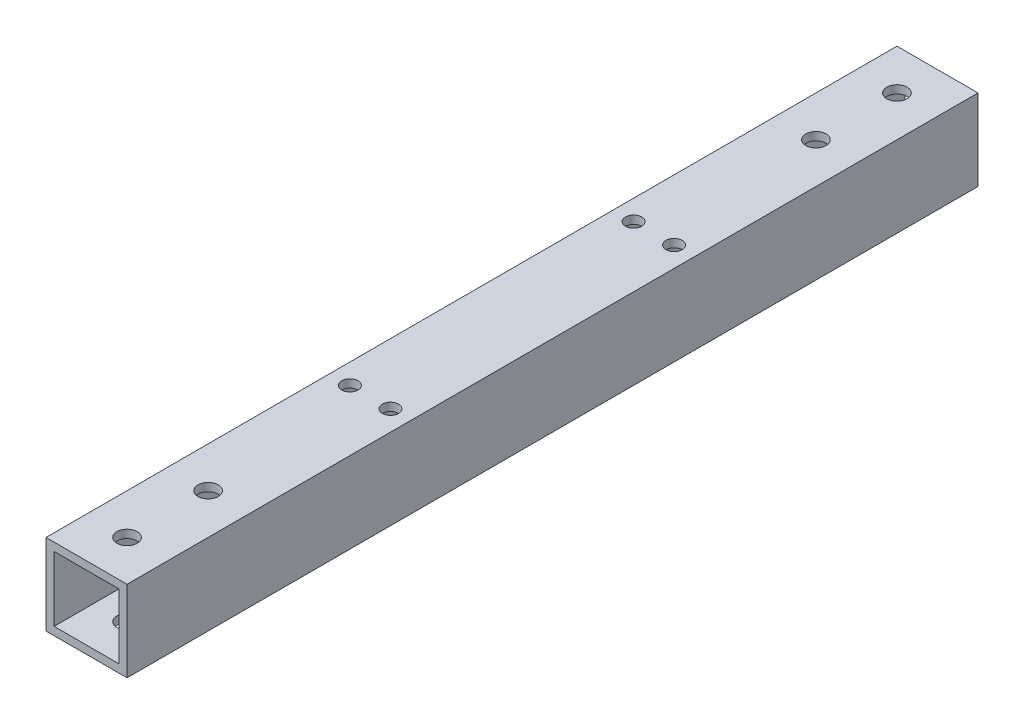
ISO-10303-21;
HEADER;
FILE_DESCRIPTION(('STEP AP214'),'2;1');
FILE_NAME('part.step','',(''),(''),'','','');
FILE_SCHEMA(('AUTOMOTIVE_DESIGN { 1 0 10303 214 1 1 1 1 }'));
ENDSEC;
DATA;
#1=APPLICATION_CONTEXT('core data for automotive mechanical design processes');
#2=APPLICATION_PROTOCOL_DEFINITION('international standard','automotive_design',2000,#1);
#3=PRODUCT_CONTEXT('',#1,'mechanical');
#4=PRODUCT('Part','Part','',(#3));
#5=PRODUCT_RELATED_PRODUCT_CATEGORY('part','',(#4));
#6=PRODUCT_DEFINITION_FORMATION('','',#4);
#7=PRODUCT_DEFINITION_CONTEXT('part definition',#1,'design');
#8=PRODUCT_DEFINITION('design','',#6,#7);
#9=PRODUCT_DEFINITION_SHAPE('','',#8);
#10=(LENGTH_UNIT() NAMED_UNIT(*) SI_UNIT(.MILLI.,.METRE.));
#11=(NAMED_UNIT(*) PLANE_ANGLE_UNIT() SI_UNIT($,.RADIAN.));
#12=(NAMED_UNIT(*) SI_UNIT($,.STERADIAN.) SOLID_ANGLE_UNIT());
#13=UNCERTAINTY_MEASURE_WITH_UNIT(LENGTH_MEASURE(1.E-05),#10,'distance_accuracy_value','');
#14=(GEOMETRIC_REPRESENTATION_CONTEXT(3) GLOBAL_UNCERTAINTY_ASSIGNED_CONTEXT((#13)) GLOBAL_UNIT_ASSIGNED_CONTEXT((#10,
#11,#12)) REPRESENTATION_CONTEXT('',''));
#15=CARTESIAN_POINT('',(0.,0.,0.));
#16=DIRECTION('',(0.,0.,1.));
#17=DIRECTION('',(1.,0.,0.));
#18=AXIS2_PLACEMENT_3D('',#15,#16,#17);
#19=CARTESIAN_POINT('',(0.,0.,210.));
#20=DIRECTION('',(0.,0.,1.));
#21=DIRECTION('',(1.,0.,0.));
#22=AXIS2_PLACEMENT_3D('',#19,#20,#21);
#23=PLANE('',#22);
#24=DIRECTION('',(0.,1.,0.));
#25=VECTOR('',#24,1.);
#26=CARTESIAN_POINT('',(10.,10.,210.));
#27=LINE('',#26,#25);
#28=CARTESIAN_POINT('',(10.,-10.,210.));
#29=VERTEX_POINT('',#28);
#30=CARTESIAN_POINT('',(10.,10.,210.));
#31=VERTEX_POINT('',#30);
#32=EDGE_CURVE('E143',#29,#31,#27,.T.);
#33=ORIENTED_EDGE('',*,*,#32,.T.);
#34=DIRECTION('',(-1.,0.,0.));
#35=VECTOR('',#34,1.);
#36=CARTESIAN_POINT('',(-9.99999999999999,10.,210.));
#37=LINE('',#36,#35);
#38=CARTESIAN_POINT('',(-9.99999999999999,10.,210.));
#39=VERTEX_POINT('',#38);
#40=EDGE_CURVE('E146',#31,#39,#37,.T.);
#41=ORIENTED_EDGE('',*,*,#40,.T.);
#42=DIRECTION('',(0.,-1.,0.));
#43=VECTOR('',#42,1.);
#44=CARTESIAN_POINT('',(-9.99999999999999,10.,210.));
#45=LINE('',#44,#43);
#46=CARTESIAN_POINT('',(-9.99999999999999,-10.,210.));
#47=VERTEX_POINT('',#46);
#48=EDGE_CURVE('E149',#39,#47,#45,.T.);
#49=ORIENTED_EDGE('',*,*,#48,.T.);
#50=DIRECTION('',(1.,0.,0.));
#51=VECTOR('',#50,1.);
#52=CARTESIAN_POINT('',(-9.99999999999999,-10.,210.));
#53=LINE('',#52,#51);
#54=EDGE_CURVE('E151',#47,#29,#53,.T.);
#55=ORIENTED_EDGE('',*,*,#54,.T.);
#56=EDGE_LOOP('',(#33,#41,#49,#55));
#57=FACE_BOUND('',#56,.T.);
#58=DIRECTION('',(-1.,0.,0.));
#59=VECTOR('',#58,1.);
#60=CARTESIAN_POINT('',(-8.,8.,210.));
#61=LINE('',#60,#59);
#62=CARTESIAN_POINT('',(8.,8.,210.));
#63=VERTEX_POINT('',#62);
#64=CARTESIAN_POINT('',(-8.,8.,210.));
#65=VERTEX_POINT('',#64);
#66=EDGE_CURVE('E113',#63,#65,#61,.T.);
#67=ORIENTED_EDGE('',*,*,#66,.F.);
#68=DIRECTION('',(0.,1.,0.));
#69=VECTOR('',#68,1.);
#70=CARTESIAN_POINT('',(8.,8.,210.));
#71=LINE('',#70,#69);
#72=CARTESIAN_POINT('',(8.,-8.,210.));
#73=VERTEX_POINT('',#72);
#74=EDGE_CURVE('E105',#73,#63,#71,.T.);
#75=ORIENTED_EDGE('',*,*,#74,.F.);
#76=DIRECTION('',(1.,0.,0.));
#77=VECTOR('',#76,1.);
#78=CARTESIAN_POINT('',(-8.,-8.,210.));
#79=LINE('',#78,#77);
#80=CARTESIAN_POINT('',(-8.,-8.,210.));
#81=VERTEX_POINT('',#80);
#82=EDGE_CURVE('E127',#81,#73,#79,.T.);
#83=ORIENTED_EDGE('',*,*,#82,.F.);
#84=DIRECTION('',(0.,-1.,0.));
#85=VECTOR('',#84,1.);
#86=CARTESIAN_POINT('',(-8.,8.,210.));
#87=LINE('',#86,#85);
#88=EDGE_CURVE('E125',#65,#81,#87,.T.);
#89=ORIENTED_EDGE('',*,*,#88,.F.);
#90=EDGE_LOOP('',(#67,#75,#83,#89));
#91=FACE_BOUND('',#90,.T.);
#92=ADVANCED_FACE('F38',(#57,#91),#23,.T.);
#93=CARTESIAN_POINT('',(0.,0.,0.));
#94=DIRECTION('',(0.,0.,1.));
#95=DIRECTION('',(1.,0.,0.));
#96=AXIS2_PLACEMENT_3D('',#93,#94,#95);
#97=PLANE('',#96);
#98=DIRECTION('',(0.,1.,0.));
#99=VECTOR('',#98,1.);
#100=CARTESIAN_POINT('',(10.,10.,0.));
#101=LINE('',#100,#99);
#102=CARTESIAN_POINT('',(10.,-10.,0.));
#103=VERTEX_POINT('',#102);
#104=CARTESIAN_POINT('',(10.,10.,0.));
#105=VERTEX_POINT('',#104);
#106=EDGE_CURVE('E121',#103,#105,#101,.T.);
#107=ORIENTED_EDGE('',*,*,#106,.F.);
#108=DIRECTION('',(1.,0.,0.));
#109=VECTOR('',#108,1.);
#110=CARTESIAN_POINT('',(-9.99999999999999,-10.,0.));
#111=LINE('',#110,#109);
#112=CARTESIAN_POINT('',(-9.99999999999999,-10.,0.));
#113=VERTEX_POINT('',#112);
#114=EDGE_CURVE('E147',#113,#103,#111,.T.);
#115=ORIENTED_EDGE('',*,*,#114,.F.);
#116=DIRECTION('',(0.,-1.,0.));
#117=VECTOR('',#116,1.);
#118=CARTESIAN_POINT('',(-9.99999999999999,10.,0.));
#119=LINE('',#118,#117);
#120=CARTESIAN_POINT('',(-9.99999999999999,10.,0.));
#121=VERTEX_POINT('',#120);
#122=EDGE_CURVE('E158',#121,#113,#119,.T.);
#123=ORIENTED_EDGE('',*,*,#122,.F.);
#124=DIRECTION('',(-1.,0.,0.));
#125=VECTOR('',#124,1.);
#126=CARTESIAN_POINT('',(-9.99999999999999,10.,0.));
#127=LINE('',#126,#125);
#128=EDGE_CURVE('E156',#105,#121,#127,.T.);
#129=ORIENTED_EDGE('',*,*,#128,.F.);
#130=EDGE_LOOP('',(#107,#115,#123,#129));
#131=FACE_BOUND('',#130,.T.);
#132=DIRECTION('',(0.,1.,0.));
#133=VECTOR('',#132,1.);
#134=CARTESIAN_POINT('',(8.,8.,0.));
#135=LINE('',#134,#133);
#136=CARTESIAN_POINT('',(8.,-8.,0.));
#137=VERTEX_POINT('',#136);
#138=CARTESIAN_POINT('',(8.,8.,0.));
#139=VERTEX_POINT('',#138);
#140=EDGE_CURVE('E63',#137,#139,#135,.T.);
#141=ORIENTED_EDGE('',*,*,#140,.T.);
#142=DIRECTION('',(-1.,0.,0.));
#143=VECTOR('',#142,1.);
#144=CARTESIAN_POINT('',(-8.,8.,0.));
#145=LINE('',#144,#143);
#146=CARTESIAN_POINT('',(-8.,8.,0.));
#147=VERTEX_POINT('',#146);
#148=EDGE_CURVE('E120',#139,#147,#145,.T.);
#149=ORIENTED_EDGE('',*,*,#148,.T.);
#150=DIRECTION('',(0.,-1.,0.));
#151=VECTOR('',#150,1.);
#152=CARTESIAN_POINT('',(-8.,8.,0.));
#153=LINE('',#152,#151);
#154=CARTESIAN_POINT('',(-8.,-8.,0.));
#155=VERTEX_POINT('',#154);
#156=EDGE_CURVE('E135',#147,#155,#153,.T.);
#157=ORIENTED_EDGE('',*,*,#156,.T.);
#158=DIRECTION('',(1.,0.,0.));
#159=VECTOR('',#158,1.);
#160=CARTESIAN_POINT('',(-8.,-8.,0.));
#161=LINE('',#160,#159);
#162=EDGE_CURVE('E114',#155,#137,#161,.T.);
#163=ORIENTED_EDGE('',*,*,#162,.T.);
#164=EDGE_LOOP('',(#141,#149,#157,#163));
#165=FACE_BOUND('',#164,.T.);
#166=ADVANCED_FACE('F277',(#131,#165),#97,.F.);
#167=CARTESIAN_POINT('',(10.,10.,210.));
#168=DIRECTION('',(-1.,0.,0.));
#169=DIRECTION('',(0.,0.,1.));
#170=AXIS2_PLACEMENT_3D('',#167,#168,#169);
#171=PLANE('',#170);
#172=ORIENTED_EDGE('',*,*,#106,.T.);
#173=DIRECTION('',(0.,0.,-1.));
#174=VECTOR('',#173,1.);
#175=CARTESIAN_POINT('',(10.,10.,210.));
#176=LINE('',#175,#174);
#177=EDGE_CURVE('E11',#31,#105,#176,.T.);
#178=ORIENTED_EDGE('',*,*,#177,.F.);
#179=ORIENTED_EDGE('',*,*,#32,.F.);
#180=DIRECTION('',(0.,0.,-1.));
#181=VECTOR('',#180,1.);
#182=CARTESIAN_POINT('',(10.,-10.,210.));
#183=LINE('',#182,#181);
#184=EDGE_CURVE('E153',#29,#103,#183,.T.);
#185=ORIENTED_EDGE('',*,*,#184,.T.);
#186=EDGE_LOOP('',(#172,#178,#179,#185));
#187=FACE_BOUND('',#186,.T.);
#188=ADVANCED_FACE('F40',(#187),#171,.F.);
#189=CARTESIAN_POINT('',(-9.99999999999999,10.,210.));
#190=DIRECTION('',(0.,-1.,0.));
#191=DIRECTION('',(0.,0.,-1.));
#192=AXIS2_PLACEMENT_3D('',#189,#190,#191);
#193=PLANE('',#192);
#194=CARTESIAN_POINT('',(-4.99999999999999,10.,140.));
#195=DIRECTION('',(0.,1.,0.));
#196=DIRECTION('',(0.,0.,-1.));
#197=AXIS2_PLACEMENT_3D('',#194,#195,#196);
#198=CIRCLE('',#197,2.);
#199=CARTESIAN_POINT('',(-4.99999999999999,10.,138.));
#200=VERTEX_POINT('',#199);
#201=EDGE_CURVE('E486',#200,#200,#198,.T.);
#202=ORIENTED_EDGE('',*,*,#201,.F.);
#203=EDGE_LOOP('',(#202));
#204=FACE_BOUND('',#203,.T.);
#205=CARTESIAN_POINT('',(4.99999999999999,10.,140.));
#206=DIRECTION('',(0.,1.,0.));
#207=DIRECTION('',(0.,0.,1.));
#208=AXIS2_PLACEMENT_3D('',#205,#206,#207);
#209=CIRCLE('',#208,2.);
#210=CARTESIAN_POINT('',(4.99999999999999,10.,142.));
#211=VERTEX_POINT('',#210);
#212=EDGE_CURVE('E490',#211,#211,#209,.T.);
#213=ORIENTED_EDGE('',*,*,#212,.F.);
#214=EDGE_LOOP('',(#213));
#215=FACE_BOUND('',#214,.T.);
#216=CARTESIAN_POINT('',(4.99999999999999,10.,70.));
#217=DIRECTION('',(0.,1.,0.));
#218=DIRECTION('',(0.,0.,-1.));
#219=AXIS2_PLACEMENT_3D('',#216,#217,#218);
#220=CIRCLE('',#219,2.);
#221=CARTESIAN_POINT('',(4.99999999999999,10.,68.));
#222=VERTEX_POINT('',#221);
#223=EDGE_CURVE('E501',#222,#222,#220,.T.);
#224=ORIENTED_EDGE('',*,*,#223,.F.);
#225=EDGE_LOOP('',(#224));
#226=FACE_BOUND('',#225,.T.);
#227=CARTESIAN_POINT('',(-4.99999999999999,10.,70.));
#228=DIRECTION('',(0.,1.,0.));
#229=DIRECTION('',(0.,0.,1.));
#230=AXIS2_PLACEMENT_3D('',#227,#228,#229);
#231=CIRCLE('',#230,2.);
#232=CARTESIAN_POINT('',(-4.99999999999999,10.,72.));
#233=VERTEX_POINT('',#232);
#234=EDGE_CURVE('E495',#233,#233,#231,.T.);
#235=ORIENTED_EDGE('',*,*,#234,.F.);
#236=EDGE_LOOP('',(#235));
#237=FACE_BOUND('',#236,.T.);
#238=CARTESIAN_POINT('',(0.,10.,10.));
#239=DIRECTION('',(0.,1.,0.));
#240=DIRECTION('',(0.,0.,1.));
#241=AXIS2_PLACEMENT_3D('',#238,#239,#240);
#242=CIRCLE('',#241,2.5);
#243=CARTESIAN_POINT('',(0.,10.,12.5));
#244=VERTEX_POINT('',#243);
#245=EDGE_CURVE('E212',#244,#244,#242,.T.);
#246=ORIENTED_EDGE('',*,*,#245,.F.);
#247=EDGE_LOOP('',(#246));
#248=FACE_BOUND('',#247,.T.);
#249=CARTESIAN_POINT('',(0.,10.,180.));
#250=DIRECTION('',(0.,1.,0.));
#251=DIRECTION('',(0.,0.,-1.));
#252=AXIS2_PLACEMENT_3D('',#249,#250,#251);
#253=CIRCLE('',#252,2.5);
#254=CARTESIAN_POINT('',(0.,10.,177.5));
#255=VERTEX_POINT('',#254);
#256=EDGE_CURVE('E209',#255,#255,#253,.T.);
#257=ORIENTED_EDGE('',*,*,#256,.F.);
#258=EDGE_LOOP('',(#257));
#259=FACE_BOUND('',#258,.T.);
#260=CARTESIAN_POINT('',(0.,10.,200.));
#261=DIRECTION('',(0.,1.,0.));
#262=DIRECTION('',(0.,0.,-1.));
#263=AXIS2_PLACEMENT_3D('',#260,#261,#262);
#264=CIRCLE('',#263,2.5);
#265=CARTESIAN_POINT('',(0.,10.,197.5));
#266=VERTEX_POINT('',#265);
#267=EDGE_CURVE('E219',#266,#266,#264,.T.);
#268=ORIENTED_EDGE('',*,*,#267,.F.);
#269=EDGE_LOOP('',(#268));
#270=FACE_BOUND('',#269,.T.);
#271=CARTESIAN_POINT('',(0.,10.,30.));
#272=DIRECTION('',(0.,1.,0.));
#273=DIRECTION('',(0.,0.,1.));
#274=AXIS2_PLACEMENT_3D('',#271,#272,#273);
#275=CIRCLE('',#274,2.5);
#276=CARTESIAN_POINT('',(0.,10.,32.5));
#277=VERTEX_POINT('',#276);
#278=EDGE_CURVE('E224',#277,#277,#275,.T.);
#279=ORIENTED_EDGE('',*,*,#278,.F.);
#280=EDGE_LOOP('',(#279));
#281=FACE_BOUND('',#280,.T.);
#282=ORIENTED_EDGE('',*,*,#128,.T.);
#283=DIRECTION('',(0.,0.,-1.));
#284=VECTOR('',#283,1.);
#285=CARTESIAN_POINT('',(-9.99999999999999,10.,210.));
#286=LINE('',#285,#284);
#287=EDGE_CURVE('E47',#39,#121,#286,.T.);
#288=ORIENTED_EDGE('',*,*,#287,.F.);
#289=ORIENTED_EDGE('',*,*,#40,.F.);
#290=ORIENTED_EDGE('',*,*,#177,.T.);
#291=EDGE_LOOP('',(#282,#288,#289,#290));
#292=FACE_BOUND('',#291,.T.);
#293=ADVANCED_FACE('F263',(#204,#215,#226,#237,#248,#259,#270,#281,#292),#193,.F.);
#294=CARTESIAN_POINT('',(-9.99999999999999,10.,210.));
#295=DIRECTION('',(1.,0.,0.));
#296=DIRECTION('',(0.,0.,-1.));
#297=AXIS2_PLACEMENT_3D('',#294,#295,#296);
#298=PLANE('',#297);
#299=ORIENTED_EDGE('',*,*,#122,.T.);
#300=DIRECTION('',(0.,0.,-1.));
#301=VECTOR('',#300,1.);
#302=CARTESIAN_POINT('',(-9.99999999999999,-10.,210.));
#303=LINE('',#302,#301);
#304=EDGE_CURVE('E163',#47,#113,#303,.T.);
#305=ORIENTED_EDGE('',*,*,#304,.F.);
#306=ORIENTED_EDGE('',*,*,#48,.F.);
#307=ORIENTED_EDGE('',*,*,#287,.T.);
#308=EDGE_LOOP('',(#299,#305,#306,#307));
#309=FACE_BOUND('',#308,.T.);
#310=ADVANCED_FACE('F266',(#309),#298,.F.);
#311=CARTESIAN_POINT('',(-9.99999999999999,-10.,210.));
#312=DIRECTION('',(0.,1.,0.));
#313=DIRECTION('',(0.,0.,1.));
#314=AXIS2_PLACEMENT_3D('',#311,#312,#313);
#315=PLANE('',#314);
#316=CARTESIAN_POINT('',(-4.99999999999999,-10.,140.));
#317=DIRECTION('',(0.,1.,0.));
#318=DIRECTION('',(0.,0.,-1.));
#319=AXIS2_PLACEMENT_3D('',#316,#317,#318);
#320=CIRCLE('',#319,2.);
#321=CARTESIAN_POINT('',(-4.99999999999999,-10.,138.));
#322=VERTEX_POINT('',#321);
#323=EDGE_CURVE('E487',#322,#322,#320,.T.);
#324=ORIENTED_EDGE('',*,*,#323,.T.);
#325=EDGE_LOOP('',(#324));
#326=FACE_BOUND('',#325,.T.);
#327=CARTESIAN_POINT('',(4.99999999999999,-10.,140.));
#328=DIRECTION('',(0.,1.,0.));
#329=DIRECTION('',(0.,0.,1.));
#330=AXIS2_PLACEMENT_3D('',#327,#328,#329);
#331=CIRCLE('',#330,2.);
#332=CARTESIAN_POINT('',(4.99999999999999,-10.,142.));
#333=VERTEX_POINT('',#332);
#334=EDGE_CURVE('E506',#333,#333,#331,.T.);
#335=ORIENTED_EDGE('',*,*,#334,.T.);
#336=EDGE_LOOP('',(#335));
#337=FACE_BOUND('',#336,.T.);
#338=CARTESIAN_POINT('',(4.99999999999999,-10.,70.));
#339=DIRECTION('',(0.,1.,0.));
#340=DIRECTION('',(0.,0.,-1.));
#341=AXIS2_PLACEMENT_3D('',#338,#339,#340);
#342=CIRCLE('',#341,2.);
#343=CARTESIAN_POINT('',(4.99999999999999,-10.,68.));
#344=VERTEX_POINT('',#343);
#345=EDGE_CURVE('E497',#344,#344,#342,.T.);
#346=ORIENTED_EDGE('',*,*,#345,.T.);
#347=EDGE_LOOP('',(#346));
#348=FACE_BOUND('',#347,.T.);
#349=CARTESIAN_POINT('',(-4.99999999999999,-10.,70.));
#350=DIRECTION('',(0.,1.,0.));
#351=DIRECTION('',(0.,0.,1.));
#352=AXIS2_PLACEMENT_3D('',#349,#350,#351);
#353=CIRCLE('',#352,2.);
#354=CARTESIAN_POINT('',(-4.99999999999999,-10.,72.));
#355=VERTEX_POINT('',#354);
#356=EDGE_CURVE('E188',#355,#355,#353,.T.);
#357=ORIENTED_EDGE('',*,*,#356,.T.);
#358=EDGE_LOOP('',(#357));
#359=FACE_BOUND('',#358,.T.);
#360=CARTESIAN_POINT('',(0.,-10.,10.));
#361=DIRECTION('',(0.,1.,0.));
#362=DIRECTION('',(0.,0.,1.));
#363=AXIS2_PLACEMENT_3D('',#360,#361,#362);
#364=CIRCLE('',#363,2.5);
#365=CARTESIAN_POINT('',(0.,-10.,12.5));
#366=VERTEX_POINT('',#365);
#367=EDGE_CURVE('E172',#366,#366,#364,.T.);
#368=ORIENTED_EDGE('',*,*,#367,.T.);
#369=EDGE_LOOP('',(#368));
#370=FACE_BOUND('',#369,.T.);
#371=CARTESIAN_POINT('',(0.,-10.,180.));
#372=DIRECTION('',(0.,1.,0.));
#373=DIRECTION('',(0.,0.,-1.));
#374=AXIS2_PLACEMENT_3D('',#371,#372,#373);
#375=CIRCLE('',#374,2.5);
#376=CARTESIAN_POINT('',(0.,-10.,177.5));
#377=VERTEX_POINT('',#376);
#378=EDGE_CURVE('E216',#377,#377,#375,.T.);
#379=ORIENTED_EDGE('',*,*,#378,.T.);
#380=EDGE_LOOP('',(#379));
#381=FACE_BOUND('',#380,.T.);
#382=CARTESIAN_POINT('',(0.,-10.,200.));
#383=DIRECTION('',(0.,1.,0.));
#384=DIRECTION('',(0.,0.,-1.));
#385=AXIS2_PLACEMENT_3D('',#382,#383,#384);
#386=CIRCLE('',#385,2.5);
#387=CARTESIAN_POINT('',(0.,-10.,197.5));
#388=VERTEX_POINT('',#387);
#389=EDGE_CURVE('E227',#388,#388,#386,.T.);
#390=ORIENTED_EDGE('',*,*,#389,.T.);
#391=EDGE_LOOP('',(#390));
#392=FACE_BOUND('',#391,.T.);
#393=CARTESIAN_POINT('',(0.,-10.,30.));
#394=DIRECTION('',(0.,1.,0.));
#395=DIRECTION('',(0.,0.,1.));
#396=AXIS2_PLACEMENT_3D('',#393,#394,#395);
#397=CIRCLE('',#396,2.5);
#398=CARTESIAN_POINT('',(0.,-10.,32.5));
#399=VERTEX_POINT('',#398);
#400=EDGE_CURVE('E215',#399,#399,#397,.T.);
#401=ORIENTED_EDGE('',*,*,#400,.T.);
#402=EDGE_LOOP('',(#401));
#403=FACE_BOUND('',#402,.T.);
#404=ORIENTED_EDGE('',*,*,#114,.T.);
#405=ORIENTED_EDGE('',*,*,#184,.F.);
#406=ORIENTED_EDGE('',*,*,#54,.F.);
#407=ORIENTED_EDGE('',*,*,#304,.T.);
#408=EDGE_LOOP('',(#404,#405,#406,#407));
#409=FACE_BOUND('',#408,.T.);
#410=ADVANCED_FACE('F281',(#326,#337,#348,#359,#370,#381,#392,#403,#409),#315,.F.);
#411=CARTESIAN_POINT('',(8.,8.,210.));
#412=DIRECTION('',(-1.,0.,0.));
#413=DIRECTION('',(0.,0.,1.));
#414=AXIS2_PLACEMENT_3D('',#411,#412,#413);
#415=PLANE('',#414);
#416=ORIENTED_EDGE('',*,*,#140,.F.);
#417=DIRECTION('',(0.,0.,-1.));
#418=VECTOR('',#417,1.);
#419=CARTESIAN_POINT('',(8.,-8.,210.));
#420=LINE('',#419,#418);
#421=EDGE_CURVE('E109',#73,#137,#420,.T.);
#422=ORIENTED_EDGE('',*,*,#421,.F.);
#423=ORIENTED_EDGE('',*,*,#74,.T.);
#424=DIRECTION('',(0.,0.,-1.));
#425=VECTOR('',#424,1.);
#426=CARTESIAN_POINT('',(8.,8.,210.));
#427=LINE('',#426,#425);
#428=EDGE_CURVE('E108',#63,#139,#427,.T.);
#429=ORIENTED_EDGE('',*,*,#428,.T.);
#430=EDGE_LOOP('',(#416,#422,#423,#429));
#431=FACE_BOUND('',#430,.T.);
#432=ADVANCED_FACE('F107',(#431),#415,.T.);
#433=CARTESIAN_POINT('',(-8.,8.,210.));
#434=DIRECTION('',(0.,-1.,0.));
#435=DIRECTION('',(0.,0.,-1.));
#436=AXIS2_PLACEMENT_3D('',#433,#434,#435);
#437=PLANE('',#436);
#438=CARTESIAN_POINT('',(-4.99999999999999,8.,140.));
#439=DIRECTION('',(0.,-1.,0.));
#440=DIRECTION('',(0.,0.,-1.));
#441=AXIS2_PLACEMENT_3D('',#438,#439,#440);
#442=CIRCLE('',#441,2.);
#443=CARTESIAN_POINT('',(-4.99999999999999,8.,138.));
#444=VERTEX_POINT('',#443);
#445=EDGE_CURVE('E206',#444,#444,#442,.T.);
#446=ORIENTED_EDGE('',*,*,#445,.F.);
#447=EDGE_LOOP('',(#446));
#448=FACE_BOUND('',#447,.T.);
#449=CARTESIAN_POINT('',(4.99999999999999,8.,140.));
#450=DIRECTION('',(0.,-1.,0.));
#451=DIRECTION('',(0.,0.,-1.));
#452=AXIS2_PLACEMENT_3D('',#449,#450,#451);
#453=CIRCLE('',#452,2.);
#454=CARTESIAN_POINT('',(4.99999999999999,8.,138.));
#455=VERTEX_POINT('',#454);
#456=EDGE_CURVE('E194',#455,#455,#453,.T.);
#457=ORIENTED_EDGE('',*,*,#456,.F.);
#458=EDGE_LOOP('',(#457));
#459=FACE_BOUND('',#458,.T.);
#460=CARTESIAN_POINT('',(4.99999999999999,8.,70.));
#461=DIRECTION('',(0.,-1.,0.));
#462=DIRECTION('',(0.,0.,-1.));
#463=AXIS2_PLACEMENT_3D('',#460,#461,#462);
#464=CIRCLE('',#463,2.);
#465=CARTESIAN_POINT('',(4.99999999999999,8.,68.));
#466=VERTEX_POINT('',#465);
#467=EDGE_CURVE('E191',#466,#466,#464,.T.);
#468=ORIENTED_EDGE('',*,*,#467,.F.);
#469=EDGE_LOOP('',(#468));
#470=FACE_BOUND('',#469,.T.);
#471=CARTESIAN_POINT('',(-4.99999999999999,8.,70.));
#472=DIRECTION('',(0.,-1.,0.));
#473=DIRECTION('',(0.,0.,-1.));
#474=AXIS2_PLACEMENT_3D('',#471,#472,#473);
#475=CIRCLE('',#474,2.);
#476=CARTESIAN_POINT('',(-4.99999999999999,8.,68.));
#477=VERTEX_POINT('',#476);
#478=EDGE_CURVE('E187',#477,#477,#475,.T.);
#479=ORIENTED_EDGE('',*,*,#478,.F.);
#480=EDGE_LOOP('',(#479));
#481=FACE_BOUND('',#480,.T.);
#482=CARTESIAN_POINT('',(0.,8.,10.));
#483=DIRECTION('',(0.,-1.,0.));
#484=DIRECTION('',(0.,0.,-1.));
#485=AXIS2_PLACEMENT_3D('',#482,#483,#484);
#486=CIRCLE('',#485,2.5);
#487=CARTESIAN_POINT('',(0.,8.,7.5));
#488=VERTEX_POINT('',#487);
#489=EDGE_CURVE('E133',#488,#488,#486,.T.);
#490=ORIENTED_EDGE('',*,*,#489,.F.);
#491=EDGE_LOOP('',(#490));
#492=FACE_BOUND('',#491,.T.);
#493=CARTESIAN_POINT('',(0.,8.,180.));
#494=DIRECTION('',(0.,-1.,0.));
#495=DIRECTION('',(0.,0.,-1.));
#496=AXIS2_PLACEMENT_3D('',#493,#494,#495);
#497=CIRCLE('',#496,2.5);
#498=CARTESIAN_POINT('',(0.,8.,177.5));
#499=VERTEX_POINT('',#498);
#500=EDGE_CURVE('E180',#499,#499,#497,.T.);
#501=ORIENTED_EDGE('',*,*,#500,.F.);
#502=EDGE_LOOP('',(#501));
#503=FACE_BOUND('',#502,.T.);
#504=CARTESIAN_POINT('',(0.,8.,200.));
#505=DIRECTION('',(0.,-1.,0.));
#506=DIRECTION('',(0.,0.,-1.));
#507=AXIS2_PLACEMENT_3D('',#504,#505,#506);
#508=CIRCLE('',#507,2.5);
#509=CARTESIAN_POINT('',(0.,8.,197.5));
#510=VERTEX_POINT('',#509);
#511=EDGE_CURVE('E176',#510,#510,#508,.T.);
#512=ORIENTED_EDGE('',*,*,#511,.F.);
#513=EDGE_LOOP('',(#512));
#514=FACE_BOUND('',#513,.T.);
#515=CARTESIAN_POINT('',(0.,8.,30.));
#516=DIRECTION('',(0.,-1.,0.));
#517=DIRECTION('',(0.,0.,-1.));
#518=AXIS2_PLACEMENT_3D('',#515,#516,#517);
#519=CIRCLE('',#518,2.5);
#520=CARTESIAN_POINT('',(0.,8.,27.5));
#521=VERTEX_POINT('',#520);
#522=EDGE_CURVE('E171',#521,#521,#519,.T.);
#523=ORIENTED_EDGE('',*,*,#522,.F.);
#524=EDGE_LOOP('',(#523));
#525=FACE_BOUND('',#524,.T.);
#526=ORIENTED_EDGE('',*,*,#148,.F.);
#527=ORIENTED_EDGE('',*,*,#428,.F.);
#528=ORIENTED_EDGE('',*,*,#66,.T.);
#529=DIRECTION('',(0.,0.,-1.));
#530=VECTOR('',#529,1.);
#531=CARTESIAN_POINT('',(-8.,8.,210.));
#532=LINE('',#531,#530);
#533=EDGE_CURVE('E122',#65,#147,#532,.T.);
#534=ORIENTED_EDGE('',*,*,#533,.T.);
#535=EDGE_LOOP('',(#526,#527,#528,#534));
#536=FACE_BOUND('',#535,.T.);
#537=ADVANCED_FACE('F117',(#448,#459,#470,#481,#492,#503,#514,#525,#536),#437,.T.);
#538=CARTESIAN_POINT('',(-8.,8.,210.));
#539=DIRECTION('',(1.,0.,0.));
#540=DIRECTION('',(0.,0.,-1.));
#541=AXIS2_PLACEMENT_3D('',#538,#539,#540);
#542=PLANE('',#541);
#543=ORIENTED_EDGE('',*,*,#156,.F.);
#544=ORIENTED_EDGE('',*,*,#533,.F.);
#545=ORIENTED_EDGE('',*,*,#88,.T.);
#546=DIRECTION('',(0.,0.,-1.));
#547=VECTOR('',#546,1.);
#548=CARTESIAN_POINT('',(-8.,-8.,210.));
#549=LINE('',#548,#547);
#550=EDGE_CURVE('E55',#81,#155,#549,.T.);
#551=ORIENTED_EDGE('',*,*,#550,.T.);
#552=EDGE_LOOP('',(#543,#544,#545,#551));
#553=FACE_BOUND('',#552,.T.);
#554=ADVANCED_FACE('F245',(#553),#542,.T.);
#555=CARTESIAN_POINT('',(-8.,-8.,210.));
#556=DIRECTION('',(0.,1.,0.));
#557=DIRECTION('',(0.,0.,1.));
#558=AXIS2_PLACEMENT_3D('',#555,#556,#557);
#559=PLANE('',#558);
#560=CARTESIAN_POINT('',(-4.99999999999999,-8.,140.));
#561=DIRECTION('',(0.,1.,0.));
#562=DIRECTION('',(0.,0.,1.));
#563=AXIS2_PLACEMENT_3D('',#560,#561,#562);
#564=CIRCLE('',#563,2.);
#565=CARTESIAN_POINT('',(-4.99999999999999,-8.,142.));
#566=VERTEX_POINT('',#565);
#567=EDGE_CURVE('E42',#566,#566,#564,.T.);
#568=ORIENTED_EDGE('',*,*,#567,.F.);
#569=EDGE_LOOP('',(#568));
#570=FACE_BOUND('',#569,.T.);
#571=CARTESIAN_POINT('',(4.99999999999999,-8.,140.));
#572=DIRECTION('',(0.,1.,0.));
#573=DIRECTION('',(0.,0.,1.));
#574=AXIS2_PLACEMENT_3D('',#571,#572,#573);
#575=CIRCLE('',#574,2.);
#576=CARTESIAN_POINT('',(4.99999999999999,-8.,142.));
#577=VERTEX_POINT('',#576);
#578=EDGE_CURVE('E192',#577,#577,#575,.T.);
#579=ORIENTED_EDGE('',*,*,#578,.F.);
#580=EDGE_LOOP('',(#579));
#581=FACE_BOUND('',#580,.T.);
#582=CARTESIAN_POINT('',(4.99999999999999,-8.,70.));
#583=DIRECTION('',(0.,1.,0.));
#584=DIRECTION('',(0.,0.,1.));
#585=AXIS2_PLACEMENT_3D('',#582,#583,#584);
#586=CIRCLE('',#585,2.);
#587=CARTESIAN_POINT('',(4.99999999999999,-8.,72.));
#588=VERTEX_POINT('',#587);
#589=EDGE_CURVE('E189',#588,#588,#586,.T.);
#590=ORIENTED_EDGE('',*,*,#589,.F.);
#591=EDGE_LOOP('',(#590));
#592=FACE_BOUND('',#591,.T.);
#593=CARTESIAN_POINT('',(-4.99999999999999,-8.,70.));
#594=DIRECTION('',(0.,1.,0.));
#595=DIRECTION('',(0.,0.,1.));
#596=AXIS2_PLACEMENT_3D('',#593,#594,#595);
#597=CIRCLE('',#596,2.);
#598=CARTESIAN_POINT('',(-4.99999999999999,-8.,72.));
#599=VERTEX_POINT('',#598);
#600=EDGE_CURVE('E184',#599,#599,#597,.T.);
#601=ORIENTED_EDGE('',*,*,#600,.F.);
#602=EDGE_LOOP('',(#601));
#603=FACE_BOUND('',#602,.T.);
#604=CARTESIAN_POINT('',(0.,-8.,10.));
#605=DIRECTION('',(0.,1.,0.));
#606=DIRECTION('',(0.,0.,1.));
#607=AXIS2_PLACEMENT_3D('',#604,#605,#606);
#608=CIRCLE('',#607,2.5);
#609=CARTESIAN_POINT('',(0.,-8.,12.5));
#610=VERTEX_POINT('',#609);
#611=EDGE_CURVE('E181',#610,#610,#608,.T.);
#612=ORIENTED_EDGE('',*,*,#611,.F.);
#613=EDGE_LOOP('',(#612));
#614=FACE_BOUND('',#613,.T.);
#615=CARTESIAN_POINT('',(0.,-8.,180.));
#616=DIRECTION('',(0.,1.,0.));
#617=DIRECTION('',(0.,0.,1.));
#618=AXIS2_PLACEMENT_3D('',#615,#616,#617);
#619=CIRCLE('',#618,2.5);
#620=CARTESIAN_POINT('',(0.,-8.,182.5));
#621=VERTEX_POINT('',#620);
#622=EDGE_CURVE('E177',#621,#621,#619,.T.);
#623=ORIENTED_EDGE('',*,*,#622,.F.);
#624=EDGE_LOOP('',(#623));
#625=FACE_BOUND('',#624,.T.);
#626=CARTESIAN_POINT('',(0.,-8.,200.));
#627=DIRECTION('',(0.,1.,0.));
#628=DIRECTION('',(0.,0.,1.));
#629=AXIS2_PLACEMENT_3D('',#626,#627,#628);
#630=CIRCLE('',#629,2.5);
#631=CARTESIAN_POINT('',(0.,-8.,202.5));
#632=VERTEX_POINT('',#631);
#633=EDGE_CURVE('E173',#632,#632,#630,.T.);
#634=ORIENTED_EDGE('',*,*,#633,.F.);
#635=EDGE_LOOP('',(#634));
#636=FACE_BOUND('',#635,.T.);
#637=CARTESIAN_POINT('',(0.,-8.,30.));
#638=DIRECTION('',(0.,1.,0.));
#639=DIRECTION('',(0.,0.,1.));
#640=AXIS2_PLACEMENT_3D('',#637,#638,#639);
#641=CIRCLE('',#640,2.5);
#642=CARTESIAN_POINT('',(0.,-8.,32.5));
#643=VERTEX_POINT('',#642);
#644=EDGE_CURVE('E168',#643,#643,#641,.T.);
#645=ORIENTED_EDGE('',*,*,#644,.F.);
#646=EDGE_LOOP('',(#645));
#647=FACE_BOUND('',#646,.T.);
#648=ORIENTED_EDGE('',*,*,#162,.F.);
#649=ORIENTED_EDGE('',*,*,#550,.F.);
#650=ORIENTED_EDGE('',*,*,#82,.T.);
#651=ORIENTED_EDGE('',*,*,#421,.T.);
#652=EDGE_LOOP('',(#648,#649,#650,#651));
#653=FACE_BOUND('',#652,.T.);
#654=ADVANCED_FACE('F330',(#570,#581,#592,#603,#614,#625,#636,#647,#653),#559,.T.);
#655=CARTESIAN_POINT('',(0.,-10.,30.));
#656=DIRECTION('',(0.,1.,0.));
#657=DIRECTION('',(0.,0.,1.));
#658=AXIS2_PLACEMENT_3D('',#655,#656,#657);
#659=CYLINDRICAL_SURFACE('',#658,2.5);
#660=ORIENTED_EDGE('',*,*,#644,.T.);
#661=EDGE_LOOP('',(#660));
#662=FACE_BOUND('',#661,.T.);
#663=ORIENTED_EDGE('',*,*,#400,.F.);
#664=EDGE_LOOP('',(#663));
#665=FACE_BOUND('',#664,.T.);
#666=ADVANCED_FACE('F260',(#662,#665),#659,.F.);
#667=CARTESIAN_POINT('',(0.,-10.,200.));
#668=DIRECTION('',(0.,1.,0.));
#669=DIRECTION('',(0.,0.,1.));
#670=AXIS2_PLACEMENT_3D('',#667,#668,#669);
#671=CYLINDRICAL_SURFACE('',#670,2.5);
#672=ORIENTED_EDGE('',*,*,#633,.T.);
#673=EDGE_LOOP('',(#672));
#674=FACE_BOUND('',#673,.T.);
#675=ORIENTED_EDGE('',*,*,#389,.F.);
#676=EDGE_LOOP('',(#675));
#677=FACE_BOUND('',#676,.T.);
#678=ADVANCED_FACE('F347',(#674,#677),#671,.F.);
#679=CARTESIAN_POINT('',(0.,-10.,180.));
#680=DIRECTION('',(0.,1.,0.));
#681=DIRECTION('',(0.,0.,1.));
#682=AXIS2_PLACEMENT_3D('',#679,#680,#681);
#683=CYLINDRICAL_SURFACE('',#682,2.5);
#684=ORIENTED_EDGE('',*,*,#622,.T.);
#685=EDGE_LOOP('',(#684));
#686=FACE_BOUND('',#685,.T.);
#687=ORIENTED_EDGE('',*,*,#378,.F.);
#688=EDGE_LOOP('',(#687));
#689=FACE_BOUND('',#688,.T.);
#690=ADVANCED_FACE('F353',(#686,#689),#683,.F.);
#691=CARTESIAN_POINT('',(0.,-10.,10.));
#692=DIRECTION('',(0.,1.,0.));
#693=DIRECTION('',(0.,0.,1.));
#694=AXIS2_PLACEMENT_3D('',#691,#692,#693);
#695=CYLINDRICAL_SURFACE('',#694,2.5);
#696=ORIENTED_EDGE('',*,*,#611,.T.);
#697=EDGE_LOOP('',(#696));
#698=FACE_BOUND('',#697,.T.);
#699=ORIENTED_EDGE('',*,*,#367,.F.);
#700=EDGE_LOOP('',(#699));
#701=FACE_BOUND('',#700,.T.);
#702=ADVANCED_FACE('F258',(#698,#701),#695,.F.);
#703=ORIENTED_EDGE('',*,*,#522,.T.);
#704=EDGE_LOOP('',(#703));
#705=FACE_BOUND('',#704,.T.);
#706=ORIENTED_EDGE('',*,*,#278,.T.);
#707=EDGE_LOOP('',(#706));
#708=FACE_BOUND('',#707,.T.);
#709=ADVANCED_FACE('F254',(#705,#708),#659,.F.);
#710=ORIENTED_EDGE('',*,*,#511,.T.);
#711=EDGE_LOOP('',(#710));
#712=FACE_BOUND('',#711,.T.);
#713=ORIENTED_EDGE('',*,*,#267,.T.);
#714=EDGE_LOOP('',(#713));
#715=FACE_BOUND('',#714,.T.);
#716=ADVANCED_FACE('F257',(#712,#715),#671,.F.);
#717=ORIENTED_EDGE('',*,*,#500,.T.);
#718=EDGE_LOOP('',(#717));
#719=FACE_BOUND('',#718,.T.);
#720=ORIENTED_EDGE('',*,*,#256,.T.);
#721=EDGE_LOOP('',(#720));
#722=FACE_BOUND('',#721,.T.);
#723=ADVANCED_FACE('F363',(#719,#722),#683,.F.);
#724=ORIENTED_EDGE('',*,*,#489,.T.);
#725=EDGE_LOOP('',(#724));
#726=FACE_BOUND('',#725,.T.);
#727=ORIENTED_EDGE('',*,*,#245,.T.);
#728=EDGE_LOOP('',(#727));
#729=FACE_BOUND('',#728,.T.);
#730=ADVANCED_FACE('F240',(#726,#729),#695,.F.);
#731=CARTESIAN_POINT('',(-4.99999999999999,-10.,70.));
#732=DIRECTION('',(0.,1.,0.));
#733=DIRECTION('',(0.,0.,1.));
#734=AXIS2_PLACEMENT_3D('',#731,#732,#733);
#735=CYLINDRICAL_SURFACE('',#734,2.);
#736=ORIENTED_EDGE('',*,*,#600,.T.);
#737=EDGE_LOOP('',(#736));
#738=FACE_BOUND('',#737,.T.);
#739=ORIENTED_EDGE('',*,*,#356,.F.);
#740=EDGE_LOOP('',(#739));
#741=FACE_BOUND('',#740,.T.);
#742=ADVANCED_FACE('F392',(#738,#741),#735,.F.);
#743=CARTESIAN_POINT('',(4.99999999999999,-10.,70.));
#744=DIRECTION('',(0.,1.,0.));
#745=DIRECTION('',(0.,0.,1.));
#746=AXIS2_PLACEMENT_3D('',#743,#744,#745);
#747=CYLINDRICAL_SURFACE('',#746,2.);
#748=ORIENTED_EDGE('',*,*,#589,.T.);
#749=EDGE_LOOP('',(#748));
#750=FACE_BOUND('',#749,.T.);
#751=ORIENTED_EDGE('',*,*,#345,.F.);
#752=EDGE_LOOP('',(#751));
#753=FACE_BOUND('',#752,.T.);
#754=ADVANCED_FACE('F397',(#750,#753),#747,.F.);
#755=CARTESIAN_POINT('',(4.99999999999999,-10.,140.));
#756=DIRECTION('',(0.,1.,0.));
#757=DIRECTION('',(0.,0.,1.));
#758=AXIS2_PLACEMENT_3D('',#755,#756,#757);
#759=CYLINDRICAL_SURFACE('',#758,2.);
#760=ORIENTED_EDGE('',*,*,#578,.T.);
#761=EDGE_LOOP('',(#760));
#762=FACE_BOUND('',#761,.T.);
#763=ORIENTED_EDGE('',*,*,#334,.F.);
#764=EDGE_LOOP('',(#763));
#765=FACE_BOUND('',#764,.T.);
#766=ADVANCED_FACE('F406',(#762,#765),#759,.F.);
#767=CARTESIAN_POINT('',(-4.99999999999999,-10.,140.));
#768=DIRECTION('',(0.,1.,0.));
#769=DIRECTION('',(0.,0.,1.));
#770=AXIS2_PLACEMENT_3D('',#767,#768,#769);
#771=CYLINDRICAL_SURFACE('',#770,2.);
#772=ORIENTED_EDGE('',*,*,#567,.T.);
#773=EDGE_LOOP('',(#772));
#774=FACE_BOUND('',#773,.T.);
#775=ORIENTED_EDGE('',*,*,#323,.F.);
#776=EDGE_LOOP('',(#775));
#777=FACE_BOUND('',#776,.T.);
#778=ADVANCED_FACE('F415',(#774,#777),#771,.F.);
#779=ORIENTED_EDGE('',*,*,#478,.T.);
#780=EDGE_LOOP('',(#779));
#781=FACE_BOUND('',#780,.T.);
#782=ORIENTED_EDGE('',*,*,#234,.T.);
#783=EDGE_LOOP('',(#782));
#784=FACE_BOUND('',#783,.T.);
#785=ADVANCED_FACE('F400',(#781,#784),#735,.F.);
#786=ORIENTED_EDGE('',*,*,#467,.T.);
#787=EDGE_LOOP('',(#786));
#788=FACE_BOUND('',#787,.T.);
#789=ORIENTED_EDGE('',*,*,#223,.T.);
#790=EDGE_LOOP('',(#789));
#791=FACE_BOUND('',#790,.T.);
#792=ADVANCED_FACE('F409',(#788,#791),#747,.F.);
#793=ORIENTED_EDGE('',*,*,#456,.T.);
#794=EDGE_LOOP('',(#793));
#795=FACE_BOUND('',#794,.T.);
#796=ORIENTED_EDGE('',*,*,#212,.T.);
#797=EDGE_LOOP('',(#796));
#798=FACE_BOUND('',#797,.T.);
#799=ADVANCED_FACE('F417',(#795,#798),#759,.F.);
#800=ORIENTED_EDGE('',*,*,#445,.T.);
#801=EDGE_LOOP('',(#800));
#802=FACE_BOUND('',#801,.T.);
#803=ORIENTED_EDGE('',*,*,#201,.T.);
#804=EDGE_LOOP('',(#803));
#805=FACE_BOUND('',#804,.T.);
#806=ADVANCED_FACE('F425',(#802,#805),#771,.F.);
#807=CLOSED_SHELL('',(#92,#166,#188,#293,#310,#410,#432,#537,#554,#654,#666,#678,#690,#702,#709,
#716,#723,#730,#742,#754,#766,#778,#785,#792,#799,#806));
#808=MANIFOLD_SOLID_BREP('B2',#807);
#809=ADVANCED_BREP_SHAPE_REPRESENTATION('',(#18,#808),#14);
#810=SHAPE_DEFINITION_REPRESENTATION(#9,#809);
ENDSEC;
END-ISO-10303-21;
